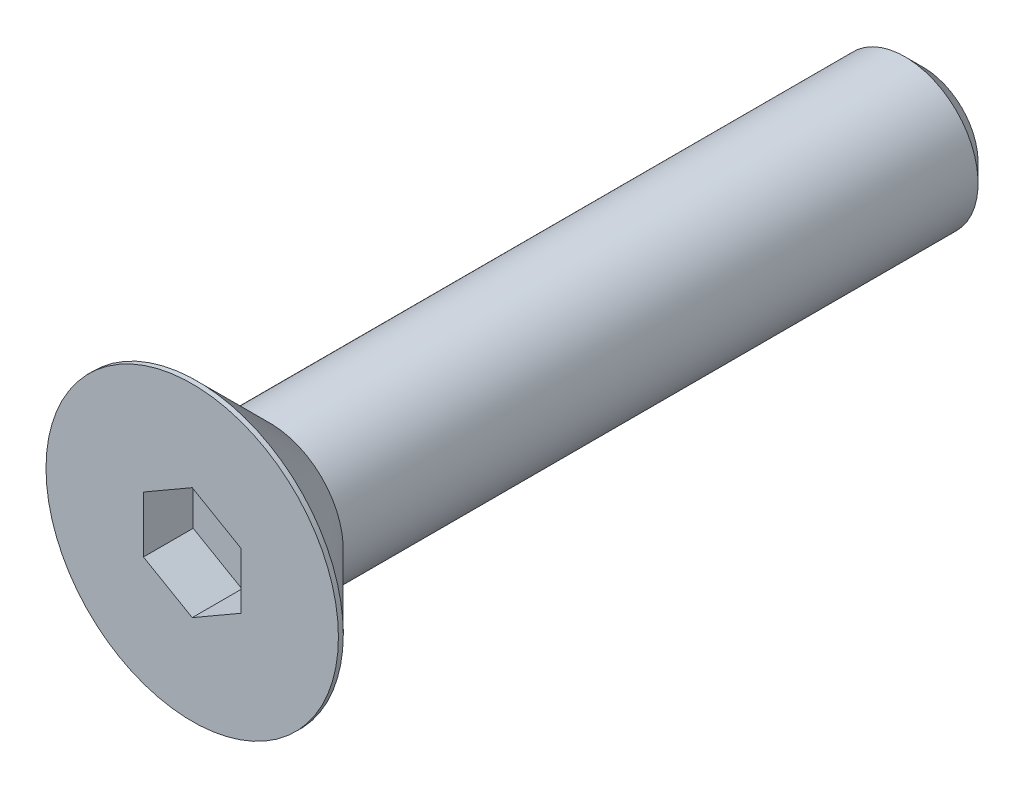
ISO-10303-21;
HEADER;
FILE_DESCRIPTION(('STEP AP214'),'2;1');
FILE_NAME('part.step','',(''),(''),'','','');
FILE_SCHEMA(('AUTOMOTIVE_DESIGN { 1 0 10303 214 1 1 1 1 }'));
ENDSEC;
DATA;
#1=APPLICATION_CONTEXT('core data for automotive mechanical design processes');
#2=APPLICATION_PROTOCOL_DEFINITION('international standard','automotive_design',2000,#1);
#3=PRODUCT_CONTEXT('',#1,'mechanical');
#4=PRODUCT('Part','Part','',(#3));
#5=PRODUCT_RELATED_PRODUCT_CATEGORY('part','',(#4));
#6=PRODUCT_DEFINITION_FORMATION('','',#4);
#7=PRODUCT_DEFINITION_CONTEXT('part definition',#1,'design');
#8=PRODUCT_DEFINITION('design','',#6,#7);
#9=PRODUCT_DEFINITION_SHAPE('','',#8);
#10=(LENGTH_UNIT() NAMED_UNIT(*) SI_UNIT(.MILLI.,.METRE.));
#11=(NAMED_UNIT(*) PLANE_ANGLE_UNIT() SI_UNIT($,.RADIAN.));
#12=(NAMED_UNIT(*) SI_UNIT($,.STERADIAN.) SOLID_ANGLE_UNIT());
#13=UNCERTAINTY_MEASURE_WITH_UNIT(LENGTH_MEASURE(1.E-05),#10,'distance_accuracy_value','');
#14=(GEOMETRIC_REPRESENTATION_CONTEXT(3) GLOBAL_UNCERTAINTY_ASSIGNED_CONTEXT((#13)) GLOBAL_UNIT_ASSIGNED_CONTEXT((#10,
#11,#12)) REPRESENTATION_CONTEXT('',''));
#15=CARTESIAN_POINT('',(0.,0.,0.));
#16=DIRECTION('',(0.,0.,1.));
#17=DIRECTION('',(1.,0.,0.));
#18=AXIS2_PLACEMENT_3D('',#15,#16,#17);
#19=CARTESIAN_POINT('',(0.,0.,8.35));
#20=DIRECTION('',(0.,0.,1.));
#21=DIRECTION('',(1.,0.,0.));
#22=AXIS2_PLACEMENT_3D('',#19,#20,#21);
#23=PLANE('',#22);
#24=DIRECTION('',(0.866025403784439,-0.5,0.));
#25=VECTOR('',#24,1.);
#26=CARTESIAN_POINT('',(-1.,-0.577350269189627,8.35));
#27=LINE('',#26,#25);
#28=CARTESIAN_POINT('',(-1.,-0.577350269189627,8.35));
#29=VERTEX_POINT('',#28);
#30=CARTESIAN_POINT('',(0.,-1.15470053837925,8.35));
#31=VERTEX_POINT('',#30);
#32=EDGE_CURVE('E56',#29,#31,#27,.T.);
#33=ORIENTED_EDGE('',*,*,#32,.F.);
#34=DIRECTION('',(0.,-1.,0.));
#35=VECTOR('',#34,1.);
#36=CARTESIAN_POINT('',(-1.,0.577350269189626,8.35));
#37=LINE('',#36,#35);
#38=CARTESIAN_POINT('',(-1.,0.577350269189626,8.35));
#39=VERTEX_POINT('',#38);
#40=EDGE_CURVE('E149',#39,#29,#37,.T.);
#41=ORIENTED_EDGE('',*,*,#40,.F.);
#42=DIRECTION('',(-0.866025403784439,-0.5,0.));
#43=VECTOR('',#42,1.);
#44=CARTESIAN_POINT('',(0.,1.15470053837925,8.35));
#45=LINE('',#44,#43);
#46=CARTESIAN_POINT('',(0.,1.15470053837925,8.35));
#47=VERTEX_POINT('',#46);
#48=EDGE_CURVE('E146',#47,#39,#45,.T.);
#49=ORIENTED_EDGE('',*,*,#48,.F.);
#50=DIRECTION('',(-0.866025403784439,0.5,0.));
#51=VECTOR('',#50,1.);
#52=CARTESIAN_POINT('',(1.,0.577350269189625,8.35));
#53=LINE('',#52,#51);
#54=CARTESIAN_POINT('',(1.,0.577350269189625,8.35));
#55=VERTEX_POINT('',#54);
#56=EDGE_CURVE('E104',#55,#47,#53,.T.);
#57=ORIENTED_EDGE('',*,*,#56,.F.);
#58=DIRECTION('',(0.,1.,0.));
#59=VECTOR('',#58,1.);
#60=CARTESIAN_POINT('',(1.,-0.577350269189627,8.35));
#61=LINE('',#60,#59);
#62=CARTESIAN_POINT('',(1.,-0.577350269189627,8.35));
#63=VERTEX_POINT('',#62);
#64=EDGE_CURVE('E140',#63,#55,#61,.T.);
#65=ORIENTED_EDGE('',*,*,#64,.F.);
#66=DIRECTION('',(0.866025403784439,0.5,0.));
#67=VECTOR('',#66,1.);
#68=CARTESIAN_POINT('',(0.,-1.15470053837925,8.35));
#69=LINE('',#68,#67);
#70=EDGE_CURVE('E136',#31,#63,#69,.T.);
#71=ORIENTED_EDGE('',*,*,#70,.F.);
#72=EDGE_LOOP('',(#33,#41,#49,#57,#65,#71));
#73=FACE_BOUND('',#72,.T.);
#74=CARTESIAN_POINT('',(0.,0.,8.35));
#75=DIRECTION('',(0.,0.,-1.));
#76=DIRECTION('',(-1.,0.,0.));
#77=AXIS2_PLACEMENT_3D('',#74,#75,#76);
#78=CIRCLE('',#77,3.);
#79=CARTESIAN_POINT('',(-3.,0.,8.35));
#80=VERTEX_POINT('',#79);
#81=EDGE_CURVE('E11',#80,#80,#78,.T.);
#82=ORIENTED_EDGE('',*,*,#81,.F.);
#83=EDGE_LOOP('',(#82));
#84=FACE_BOUND('',#83,.T.);
#85=ADVANCED_FACE('F41',(#73,#84),#23,.T.);
#86=CARTESIAN_POINT('',(0.,0.,-6.65));
#87=DIRECTION('',(0.,0.,-1.));
#88=DIRECTION('',(-1.,0.,0.));
#89=AXIS2_PLACEMENT_3D('',#86,#87,#88);
#90=CYLINDRICAL_SURFACE('',#89,3.);
#91=ORIENTED_EDGE('',*,*,#81,.T.);
#92=EDGE_LOOP('',(#91));
#93=FACE_BOUND('',#92,.T.);
#94=CARTESIAN_POINT('',(0.,0.,8.25000000000001));
#95=DIRECTION('',(0.,0.,-1.));
#96=DIRECTION('',(-1.,0.,0.));
#97=AXIS2_PLACEMENT_3D('',#94,#95,#96);
#98=CIRCLE('',#97,3.);
#99=CARTESIAN_POINT('',(-3.,0.,8.25000000000001));
#100=VERTEX_POINT('',#99);
#101=EDGE_CURVE('E49',#100,#100,#98,.T.);
#102=ORIENTED_EDGE('',*,*,#101,.F.);
#103=EDGE_LOOP('',(#102));
#104=FACE_BOUND('',#103,.T.);
#105=ADVANCED_FACE('F182',(#93,#104),#90,.T.);
#106=CARTESIAN_POINT('',(0.,0.,6.74999999999999));
#107=DIRECTION('',(0.,0.,1.));
#108=DIRECTION('',(1.,0.,0.));
#109=AXIS2_PLACEMENT_3D('',#106,#107,#108);
#110=CONICAL_SURFACE('',#109,1.5,0.785398163397443);
#111=ORIENTED_EDGE('',*,*,#101,.T.);
#112=EDGE_LOOP('',(#111));
#113=FACE_BOUND('',#112,.T.);
#114=CARTESIAN_POINT('',(0.,0.,6.74999999999999));
#115=DIRECTION('',(0.,0.,-1.));
#116=DIRECTION('',(-1.,0.,0.));
#117=AXIS2_PLACEMENT_3D('',#114,#115,#116);
#118=CIRCLE('',#117,1.5);
#119=CARTESIAN_POINT('',(-1.5,0.,6.74999999999999));
#120=VERTEX_POINT('',#119);
#121=EDGE_CURVE('E172',#120,#120,#118,.T.);
#122=ORIENTED_EDGE('',*,*,#121,.F.);
#123=EDGE_LOOP('',(#122));
#124=FACE_BOUND('',#123,.T.);
#125=ADVANCED_FACE('F179',(#113,#124),#110,.T.);
#126=CARTESIAN_POINT('',(0.,0.,-6.65));
#127=DIRECTION('',(0.,0.,-1.));
#128=DIRECTION('',(-1.,0.,0.));
#129=AXIS2_PLACEMENT_3D('',#126,#127,#128);
#130=CYLINDRICAL_SURFACE('',#129,1.5);
#131=ORIENTED_EDGE('',*,*,#121,.T.);
#132=EDGE_LOOP('',(#131));
#133=FACE_BOUND('',#132,.T.);
#134=CARTESIAN_POINT('',(0.,0.,-6.275));
#135=DIRECTION('',(0.,0.,-1.));
#136=DIRECTION('',(-1.,0.,0.));
#137=AXIS2_PLACEMENT_3D('',#134,#135,#136);
#138=CIRCLE('',#137,1.5);
#139=CARTESIAN_POINT('',(-1.5,0.,-6.275));
#140=VERTEX_POINT('',#139);
#141=EDGE_CURVE('E168',#140,#140,#138,.T.);
#142=ORIENTED_EDGE('',*,*,#141,.F.);
#143=EDGE_LOOP('',(#142));
#144=FACE_BOUND('',#143,.T.);
#145=ADVANCED_FACE('F189',(#133,#144),#130,.T.);
#146=CARTESIAN_POINT('',(0.,0.,-6.65));
#147=DIRECTION('',(0.,0.,1.));
#148=DIRECTION('',(1.,0.,0.));
#149=AXIS2_PLACEMENT_3D('',#146,#147,#148);
#150=CONICAL_SURFACE('',#149,1.125,0.785398163397454);
#151=ORIENTED_EDGE('',*,*,#141,.T.);
#152=EDGE_LOOP('',(#151));
#153=FACE_BOUND('',#152,.T.);
#154=CARTESIAN_POINT('',(0.,0.,-6.65));
#155=DIRECTION('',(0.,0.,-1.));
#156=DIRECTION('',(-1.,0.,0.));
#157=AXIS2_PLACEMENT_3D('',#154,#155,#156);
#158=CIRCLE('',#157,1.125);
#159=CARTESIAN_POINT('',(-1.125,0.,-6.65));
#160=VERTEX_POINT('',#159);
#161=EDGE_CURVE('E155',#160,#160,#158,.T.);
#162=ORIENTED_EDGE('',*,*,#161,.F.);
#163=EDGE_LOOP('',(#162));
#164=FACE_BOUND('',#163,.T.);
#165=ADVANCED_FACE('F195',(#153,#164),#150,.T.);
#166=CARTESIAN_POINT('',(0.,1.125,-6.65));
#167=DIRECTION('',(0.,0.,-1.));
#168=DIRECTION('',(-1.,0.,0.));
#169=AXIS2_PLACEMENT_3D('',#166,#167,#168);
#170=PLANE('',#169);
#171=ORIENTED_EDGE('',*,*,#161,.T.);
#172=EDGE_LOOP('',(#171));
#173=FACE_BOUND('',#172,.T.);
#174=ADVANCED_FACE('F199',(#173),#170,.T.);
#175=CARTESIAN_POINT('',(-1.,-0.577350269189627,7.33));
#176=DIRECTION('',(-0.5,-0.866025403784439,0.));
#177=DIRECTION('',(0.866025403784439,-0.5,0.));
#178=AXIS2_PLACEMENT_3D('',#175,#176,#177);
#179=PLANE('',#178);
#180=ORIENTED_EDGE('',*,*,#32,.T.);
#181=DIRECTION('',(0.,0.,1.));
#182=VECTOR('',#181,1.);
#183=CARTESIAN_POINT('',(0.,-1.15470053837925,7.33));
#184=LINE('',#183,#182);
#185=CARTESIAN_POINT('',(0.,-1.15470053837925,7.33));
#186=VERTEX_POINT('',#185);
#187=EDGE_CURVE('E86',#186,#31,#184,.T.);
#188=ORIENTED_EDGE('',*,*,#187,.F.);
#189=DIRECTION('',(0.866025403784439,-0.5,0.));
#190=VECTOR('',#189,1.);
#191=CARTESIAN_POINT('',(-1.,-0.577350269189627,7.33));
#192=LINE('',#191,#190);
#193=CARTESIAN_POINT('',(-1.,-0.577350269189627,7.33));
#194=VERTEX_POINT('',#193);
#195=EDGE_CURVE('E152',#194,#186,#192,.T.);
#196=ORIENTED_EDGE('',*,*,#195,.F.);
#197=DIRECTION('',(0.,0.,1.));
#198=VECTOR('',#197,1.);
#199=CARTESIAN_POINT('',(-1.,-0.577350269189627,7.33));
#200=LINE('',#199,#198);
#201=EDGE_CURVE('E64',#194,#29,#200,.T.);
#202=ORIENTED_EDGE('',*,*,#201,.T.);
#203=EDGE_LOOP('',(#180,#188,#196,#202));
#204=FACE_BOUND('',#203,.T.);
#205=ADVANCED_FACE('F203',(#204),#179,.F.);
#206=CARTESIAN_POINT('',(-1.,0.577350269189626,7.33));
#207=DIRECTION('',(-1.,0.,0.));
#208=DIRECTION('',(0.,-1.,0.));
#209=AXIS2_PLACEMENT_3D('',#206,#207,#208);
#210=PLANE('',#209);
#211=ORIENTED_EDGE('',*,*,#40,.T.);
#212=ORIENTED_EDGE('',*,*,#201,.F.);
#213=DIRECTION('',(0.,-1.,0.));
#214=VECTOR('',#213,1.);
#215=CARTESIAN_POINT('',(-1.,0.577350269189626,7.33));
#216=LINE('',#215,#214);
#217=CARTESIAN_POINT('',(-1.,0.577350269189626,7.33));
#218=VERTEX_POINT('',#217);
#219=EDGE_CURVE('E118',#218,#194,#216,.T.);
#220=ORIENTED_EDGE('',*,*,#219,.F.);
#221=DIRECTION('',(0.,0.,1.));
#222=VECTOR('',#221,1.);
#223=CARTESIAN_POINT('',(-1.,0.577350269189626,7.33));
#224=LINE('',#223,#222);
#225=EDGE_CURVE('E109',#218,#39,#224,.T.);
#226=ORIENTED_EDGE('',*,*,#225,.T.);
#227=EDGE_LOOP('',(#211,#212,#220,#226));
#228=FACE_BOUND('',#227,.T.);
#229=ADVANCED_FACE('F207',(#228),#210,.F.);
#230=CARTESIAN_POINT('',(0.,1.15470053837925,7.33));
#231=DIRECTION('',(-0.5,0.866025403784439,0.));
#232=DIRECTION('',(-0.866025403784439,-0.5,0.));
#233=AXIS2_PLACEMENT_3D('',#230,#231,#232);
#234=PLANE('',#233);
#235=ORIENTED_EDGE('',*,*,#48,.T.);
#236=ORIENTED_EDGE('',*,*,#225,.F.);
#237=DIRECTION('',(-0.866025403784439,-0.5,0.));
#238=VECTOR('',#237,1.);
#239=CARTESIAN_POINT('',(0.,1.15470053837925,7.33));
#240=LINE('',#239,#238);
#241=CARTESIAN_POINT('',(0.,1.15470053837925,7.33));
#242=VERTEX_POINT('',#241);
#243=EDGE_CURVE('E113',#242,#218,#240,.T.);
#244=ORIENTED_EDGE('',*,*,#243,.F.);
#245=DIRECTION('',(0.,0.,1.));
#246=VECTOR('',#245,1.);
#247=CARTESIAN_POINT('',(0.,1.15470053837925,7.33));
#248=LINE('',#247,#246);
#249=EDGE_CURVE('E97',#242,#47,#248,.T.);
#250=ORIENTED_EDGE('',*,*,#249,.T.);
#251=EDGE_LOOP('',(#235,#236,#244,#250));
#252=FACE_BOUND('',#251,.T.);
#253=ADVANCED_FACE('F114',(#252),#234,.F.);
#254=CARTESIAN_POINT('',(1.,0.577350269189625,7.33));
#255=DIRECTION('',(0.5,0.866025403784439,0.));
#256=DIRECTION('',(-0.866025403784438,0.5,0.));
#257=AXIS2_PLACEMENT_3D('',#254,#255,#256);
#258=PLANE('',#257);
#259=ORIENTED_EDGE('',*,*,#56,.T.);
#260=ORIENTED_EDGE('',*,*,#249,.F.);
#261=DIRECTION('',(-0.866025403784439,0.5,0.));
#262=VECTOR('',#261,1.);
#263=CARTESIAN_POINT('',(1.,0.577350269189625,7.33));
#264=LINE('',#263,#262);
#265=CARTESIAN_POINT('',(1.,0.577350269189625,7.33));
#266=VERTEX_POINT('',#265);
#267=EDGE_CURVE('E101',#266,#242,#264,.T.);
#268=ORIENTED_EDGE('',*,*,#267,.F.);
#269=DIRECTION('',(0.,0.,1.));
#270=VECTOR('',#269,1.);
#271=CARTESIAN_POINT('',(1.,0.577350269189625,7.33));
#272=LINE('',#271,#270);
#273=EDGE_CURVE('E110',#266,#55,#272,.T.);
#274=ORIENTED_EDGE('',*,*,#273,.T.);
#275=EDGE_LOOP('',(#259,#260,#268,#274));
#276=FACE_BOUND('',#275,.T.);
#277=ADVANCED_FACE('F99',(#276),#258,.F.);
#278=CARTESIAN_POINT('',(1.,-0.577350269189627,7.33));
#279=DIRECTION('',(1.,0.,0.));
#280=DIRECTION('',(0.,0.,-1.));
#281=AXIS2_PLACEMENT_3D('',#278,#279,#280);
#282=PLANE('',#281);
#283=ORIENTED_EDGE('',*,*,#64,.T.);
#284=ORIENTED_EDGE('',*,*,#273,.F.);
#285=DIRECTION('',(0.,1.,0.));
#286=VECTOR('',#285,1.);
#287=CARTESIAN_POINT('',(1.,-0.577350269189627,7.33));
#288=LINE('',#287,#286);
#289=CARTESIAN_POINT('',(1.,-0.577350269189627,7.33));
#290=VERTEX_POINT('',#289);
#291=EDGE_CURVE('E124',#290,#266,#288,.T.);
#292=ORIENTED_EDGE('',*,*,#291,.F.);
#293=DIRECTION('',(0.,0.,1.));
#294=VECTOR('',#293,1.);
#295=CARTESIAN_POINT('',(1.,-0.577350269189627,7.33));
#296=LINE('',#295,#294);
#297=EDGE_CURVE('E160',#290,#63,#296,.T.);
#298=ORIENTED_EDGE('',*,*,#297,.T.);
#299=EDGE_LOOP('',(#283,#284,#292,#298));
#300=FACE_BOUND('',#299,.T.);
#301=ADVANCED_FACE('F211',(#300),#282,.F.);
#302=CARTESIAN_POINT('',(0.,-1.15470053837925,7.33));
#303=DIRECTION('',(0.5,-0.866025403784439,0.));
#304=DIRECTION('',(0.866025403784439,0.5,0.));
#305=AXIS2_PLACEMENT_3D('',#302,#303,#304);
#306=PLANE('',#305);
#307=ORIENTED_EDGE('',*,*,#70,.T.);
#308=ORIENTED_EDGE('',*,*,#297,.F.);
#309=DIRECTION('',(0.866025403784439,0.5,0.));
#310=VECTOR('',#309,1.);
#311=CARTESIAN_POINT('',(0.,-1.15470053837925,7.33));
#312=LINE('',#311,#310);
#313=EDGE_CURVE('E128',#186,#290,#312,.T.);
#314=ORIENTED_EDGE('',*,*,#313,.F.);
#315=ORIENTED_EDGE('',*,*,#187,.T.);
#316=EDGE_LOOP('',(#307,#308,#314,#315));
#317=FACE_BOUND('',#316,.T.);
#318=ADVANCED_FACE('F208',(#317),#306,.F.);
#319=CARTESIAN_POINT('',(0.,-1.15470053837925,7.33));
#320=DIRECTION('',(0.,0.,1.));
#321=DIRECTION('',(1.,0.,0.));
#322=AXIS2_PLACEMENT_3D('',#319,#320,#321);
#323=PLANE('',#322);
#324=ORIENTED_EDGE('',*,*,#195,.T.);
#325=ORIENTED_EDGE('',*,*,#313,.T.);
#326=ORIENTED_EDGE('',*,*,#291,.T.);
#327=ORIENTED_EDGE('',*,*,#267,.T.);
#328=ORIENTED_EDGE('',*,*,#243,.T.);
#329=ORIENTED_EDGE('',*,*,#219,.T.);
#330=EDGE_LOOP('',(#324,#325,#326,#327,#328,#329));
#331=FACE_BOUND('',#330,.T.);
#332=ADVANCED_FACE('F121',(#331),#323,.T.);
#333=CLOSED_SHELL('',(#85,#105,#125,#145,#165,#174,#205,#229,#253,#277,#301,#318,#332));
#334=MANIFOLD_SOLID_BREP('B2',#333);
#335=ADVANCED_BREP_SHAPE_REPRESENTATION('',(#18,#334),#14);
#336=SHAPE_DEFINITION_REPRESENTATION(#9,#335);
ENDSEC;
END-ISO-10303-21;
